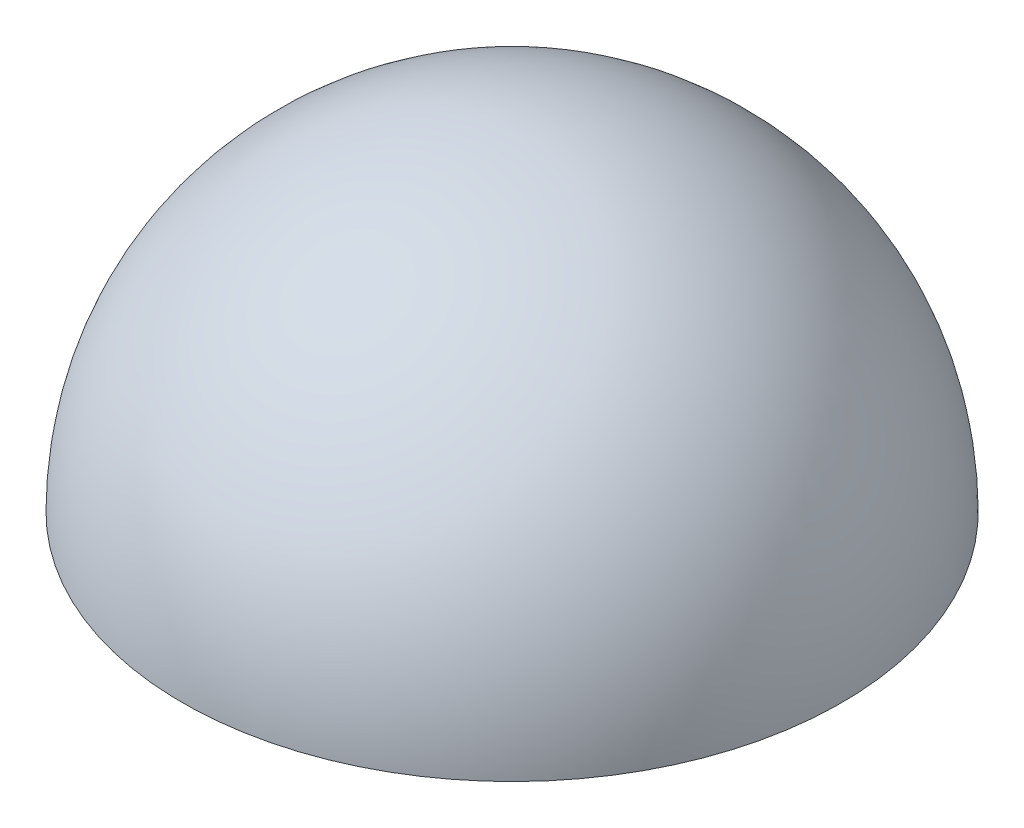
ISO-10303-21;
HEADER;
FILE_DESCRIPTION(('STEP AP214'),'2;1');
FILE_NAME('part.step','',(''),(''),'','','');
FILE_SCHEMA(('AUTOMOTIVE_DESIGN { 1 0 10303 214 1 1 1 1 }'));
ENDSEC;
DATA;
#1=APPLICATION_CONTEXT('core data for automotive mechanical design processes');
#2=APPLICATION_PROTOCOL_DEFINITION('international standard','automotive_design',2000,#1);
#3=PRODUCT_CONTEXT('',#1,'mechanical');
#4=PRODUCT('Part','Part','',(#3));
#5=PRODUCT_RELATED_PRODUCT_CATEGORY('part','',(#4));
#6=PRODUCT_DEFINITION_FORMATION('','',#4);
#7=PRODUCT_DEFINITION_CONTEXT('part definition',#1,'design');
#8=PRODUCT_DEFINITION('design','',#6,#7);
#9=PRODUCT_DEFINITION_SHAPE('','',#8);
#10=(LENGTH_UNIT() NAMED_UNIT(*) SI_UNIT(.MILLI.,.METRE.));
#11=(NAMED_UNIT(*) PLANE_ANGLE_UNIT() SI_UNIT($,.RADIAN.));
#12=(NAMED_UNIT(*) SI_UNIT($,.STERADIAN.) SOLID_ANGLE_UNIT());
#13=UNCERTAINTY_MEASURE_WITH_UNIT(LENGTH_MEASURE(1.E-05),#10,'distance_accuracy_value','');
#14=(GEOMETRIC_REPRESENTATION_CONTEXT(3) GLOBAL_UNCERTAINTY_ASSIGNED_CONTEXT((#13)) GLOBAL_UNIT_ASSIGNED_CONTEXT((#10,
#11,#12)) REPRESENTATION_CONTEXT('',''));
#15=CARTESIAN_POINT('',(0.,0.,0.));
#16=DIRECTION('',(0.,0.,1.));
#17=DIRECTION('',(1.,0.,0.));
#18=AXIS2_PLACEMENT_3D('',#15,#16,#17);
#19=CARTESIAN_POINT('',(0.,0.,0.));
#20=DIRECTION('',(-1.,0.,0.));
#21=DIRECTION('',(0.,0.,1.));
#22=AXIS2_PLACEMENT_3D('',#19,#20,#21);
#23=SPHERICAL_SURFACE('',#22,44.45);
#24=CARTESIAN_POINT('',(0.,0.,0.));
#25=DIRECTION('',(0.,-1.,0.));
#26=DIRECTION('',(0.,0.,-1.));
#27=AXIS2_PLACEMENT_3D('',#24,#25,#26);
#28=SPHERICAL_SURFACE('',#27,44.45);
#29=CARTESIAN_POINT('',(0.,0.,0.));
#30=DIRECTION('',(0.,-1.,0.));
#31=DIRECTION('',(0.,0.,-1.));
#32=AXIS2_PLACEMENT_3D('',#29,#30,#31);
#33=CIRCLE('',#32,44.45);
#34=CARTESIAN_POINT('',(0.,3.10392691023155E-13,-44.45));
#35=VERTEX_POINT('',#34);
#36=EDGE_CURVE('E10',#35,#35,#33,.T.);
#37=ORIENTED_EDGE('',*,*,#36,.F.);
#38=EDGE_LOOP('',(#37));
#39=FACE_BOUND('',#38,.T.);
#40=ADVANCED_FACE('F31',(#39),#28,.T.);
#41=CARTESIAN_POINT('',(0.,0.,0.));
#42=DIRECTION('',(0.,-1.,0.));
#43=DIRECTION('',(0.,0.,-1.));
#44=AXIS2_PLACEMENT_3D('',#41,#42,#43);
#45=PLANE('',#44);
#46=ORIENTED_EDGE('',*,*,#36,.T.);
#47=EDGE_LOOP('',(#46));
#48=FACE_BOUND('',#47,.T.);
#49=ADVANCED_FACE('F38',(#48),#45,.T.);
#50=CLOSED_SHELL('',(#40,#49));
#51=MANIFOLD_SOLID_BREP('B2',#50);
#52=ADVANCED_BREP_SHAPE_REPRESENTATION('',(#18,#51),#14);
#53=SHAPE_DEFINITION_REPRESENTATION(#9,#52);
ENDSEC;
END-ISO-10303-21;
